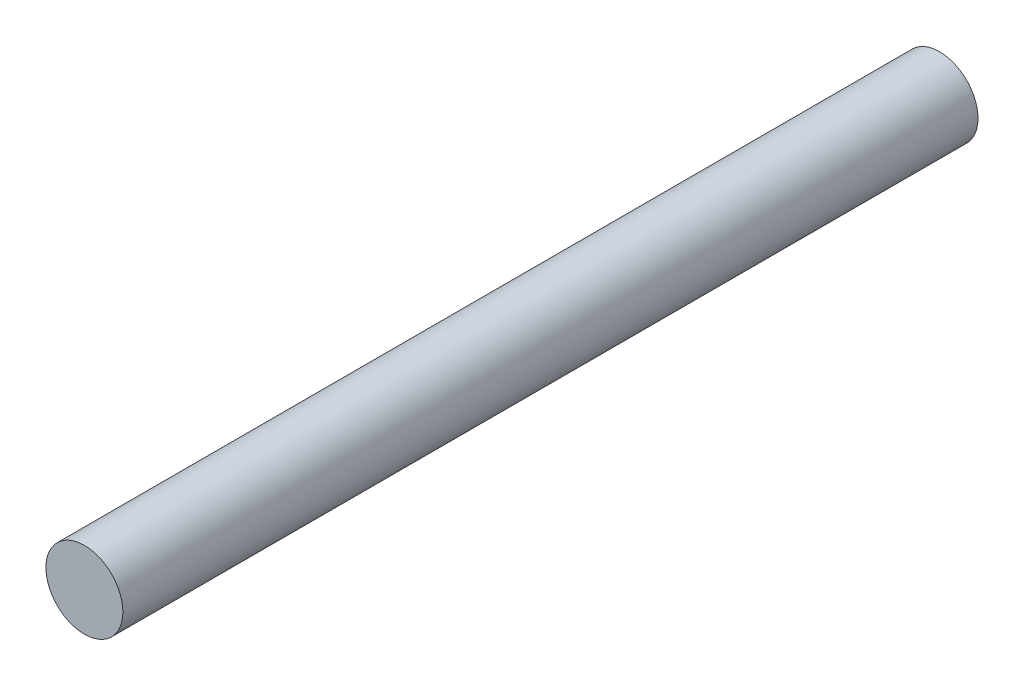
ISO-10303-21;
HEADER;
FILE_DESCRIPTION(('STEP AP214'),'2;1');
FILE_NAME('part.step','',(''),(''),'','','');
FILE_SCHEMA(('AUTOMOTIVE_DESIGN { 1 0 10303 214 1 1 1 1 }'));
ENDSEC;
DATA;
#1=APPLICATION_CONTEXT('core data for automotive mechanical design processes');
#2=APPLICATION_PROTOCOL_DEFINITION('international standard','automotive_design',2000,#1);
#3=PRODUCT_CONTEXT('',#1,'mechanical');
#4=PRODUCT('Part','Part','',(#3));
#5=PRODUCT_RELATED_PRODUCT_CATEGORY('part','',(#4));
#6=PRODUCT_DEFINITION_FORMATION('','',#4);
#7=PRODUCT_DEFINITION_CONTEXT('part definition',#1,'design');
#8=PRODUCT_DEFINITION('design','',#6,#7);
#9=PRODUCT_DEFINITION_SHAPE('','',#8);
#10=(LENGTH_UNIT() NAMED_UNIT(*) SI_UNIT(.MILLI.,.METRE.));
#11=(NAMED_UNIT(*) PLANE_ANGLE_UNIT() SI_UNIT($,.RADIAN.));
#12=(NAMED_UNIT(*) SI_UNIT($,.STERADIAN.) SOLID_ANGLE_UNIT());
#13=UNCERTAINTY_MEASURE_WITH_UNIT(LENGTH_MEASURE(1.E-05),#10,'distance_accuracy_value','');
#14=(GEOMETRIC_REPRESENTATION_CONTEXT(3) GLOBAL_UNCERTAINTY_ASSIGNED_CONTEXT((#13)) GLOBAL_UNIT_ASSIGNED_CONTEXT((#10,
#11,#12)) REPRESENTATION_CONTEXT('',''));
#15=CARTESIAN_POINT('',(0.,0.,0.));
#16=DIRECTION('',(0.,0.,1.));
#17=DIRECTION('',(1.,0.,0.));
#18=AXIS2_PLACEMENT_3D('',#15,#16,#17);
#19=CARTESIAN_POINT('',(0.,0.,2000.));
#20=DIRECTION('',(0.,0.,-1.));
#21=DIRECTION('',(-1.,0.,0.));
#22=AXIS2_PLACEMENT_3D('',#19,#20,#21);
#23=CYLINDRICAL_SURFACE('',#22,90.);
#24=CARTESIAN_POINT('',(0.,0.,2000.));
#25=DIRECTION('',(0.,0.,1.));
#26=DIRECTION('',(1.,0.,0.));
#27=AXIS2_PLACEMENT_3D('',#24,#25,#26);
#28=CIRCLE('',#27,90.);
#29=CARTESIAN_POINT('',(90.,0.,2000.));
#30=VERTEX_POINT('',#29);
#31=EDGE_CURVE('E10',#30,#30,#28,.T.);
#32=ORIENTED_EDGE('',*,*,#31,.F.);
#33=EDGE_LOOP('',(#32));
#34=FACE_BOUND('',#33,.T.);
#35=CARTESIAN_POINT('',(0.,0.,0.));
#36=DIRECTION('',(0.,0.,1.));
#37=DIRECTION('',(1.,0.,0.));
#38=AXIS2_PLACEMENT_3D('',#35,#36,#37);
#39=CIRCLE('',#38,90.);
#40=CARTESIAN_POINT('',(90.,0.,0.));
#41=VERTEX_POINT('',#40);
#42=EDGE_CURVE('E40',#41,#41,#39,.T.);
#43=ORIENTED_EDGE('',*,*,#42,.T.);
#44=EDGE_LOOP('',(#43));
#45=FACE_BOUND('',#44,.T.);
#46=ADVANCED_FACE('F37',(#34,#45),#23,.T.);
#47=CARTESIAN_POINT('',(0.,0.,2000.));
#48=DIRECTION('',(0.,0.,1.));
#49=DIRECTION('',(1.,0.,0.));
#50=AXIS2_PLACEMENT_3D('',#47,#48,#49);
#51=PLANE('',#50);
#52=ORIENTED_EDGE('',*,*,#31,.T.);
#53=EDGE_LOOP('',(#52));
#54=FACE_BOUND('',#53,.T.);
#55=ADVANCED_FACE('F52',(#54),#51,.T.);
#56=CARTESIAN_POINT('',(0.,0.,0.));
#57=DIRECTION('',(0.,0.,1.));
#58=DIRECTION('',(1.,0.,0.));
#59=AXIS2_PLACEMENT_3D('',#56,#57,#58);
#60=PLANE('',#59);
#61=ORIENTED_EDGE('',*,*,#42,.F.);
#62=EDGE_LOOP('',(#61));
#63=FACE_BOUND('',#62,.T.);
#64=ADVANCED_FACE('F50',(#63),#60,.F.);
#65=CLOSED_SHELL('',(#46,#55,#64));
#66=MANIFOLD_SOLID_BREP('B2',#65);
#67=ADVANCED_BREP_SHAPE_REPRESENTATION('',(#18,#66),#14);
#68=SHAPE_DEFINITION_REPRESENTATION(#9,#67);
ENDSEC;
END-ISO-10303-21;
